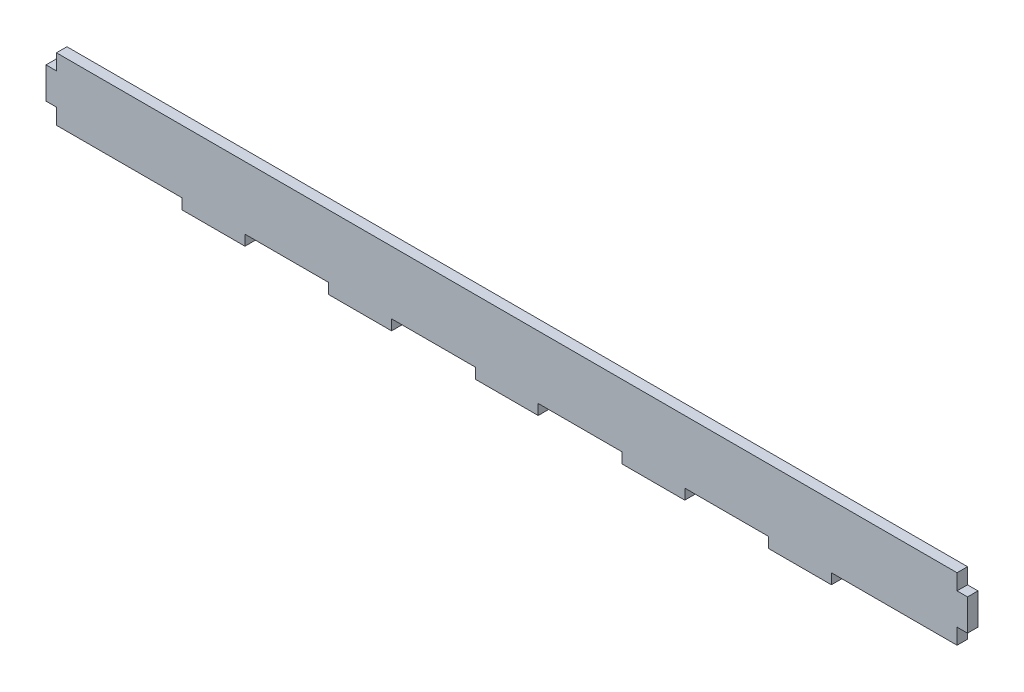
ISO-10303-21;
HEADER;
FILE_DESCRIPTION(('STEP AP214'),'2;1');
FILE_NAME('part.step','',(''),(''),'','','');
FILE_SCHEMA(('AUTOMOTIVE_DESIGN { 1 0 10303 214 1 1 1 1 }'));
ENDSEC;
DATA;
#1=APPLICATION_CONTEXT('core data for automotive mechanical design processes');
#2=APPLICATION_PROTOCOL_DEFINITION('international standard','automotive_design',2000,#1);
#3=PRODUCT_CONTEXT('',#1,'mechanical');
#4=PRODUCT('Part','Part','',(#3));
#5=PRODUCT_RELATED_PRODUCT_CATEGORY('part','',(#4));
#6=PRODUCT_DEFINITION_FORMATION('','',#4);
#7=PRODUCT_DEFINITION_CONTEXT('part definition',#1,'design');
#8=PRODUCT_DEFINITION('design','',#6,#7);
#9=PRODUCT_DEFINITION_SHAPE('','',#8);
#10=(LENGTH_UNIT() NAMED_UNIT(*) SI_UNIT(.MILLI.,.METRE.));
#11=(NAMED_UNIT(*) PLANE_ANGLE_UNIT() SI_UNIT($,.RADIAN.));
#12=(NAMED_UNIT(*) SI_UNIT($,.STERADIAN.) SOLID_ANGLE_UNIT());
#13=UNCERTAINTY_MEASURE_WITH_UNIT(LENGTH_MEASURE(1.E-05),#10,'distance_accuracy_value','');
#14=(GEOMETRIC_REPRESENTATION_CONTEXT(3) GLOBAL_UNCERTAINTY_ASSIGNED_CONTEXT((#13)) GLOBAL_UNIT_ASSIGNED_CONTEXT((#10,
#11,#12)) REPRESENTATION_CONTEXT('',''));
#15=CARTESIAN_POINT('',(0.,0.,0.));
#16=DIRECTION('',(0.,0.,1.));
#17=DIRECTION('',(1.,0.,0.));
#18=AXIS2_PLACEMENT_3D('',#15,#16,#17);
#19=CARTESIAN_POINT('',(0.,-400.000000000006,-5.));
#20=DIRECTION('',(0.,-1.,0.));
#21=DIRECTION('',(0.,0.,-1.));
#22=AXIS2_PLACEMENT_3D('',#19,#20,#21);
#23=PLANE('',#22);
#24=DIRECTION('',(1.,0.,0.));
#25=VECTOR('',#24,1.);
#26=CARTESIAN_POINT('',(0.,-400.000000000006,0.));
#27=LINE('',#26,#25);
#28=CARTESIAN_POINT('',(9.99972860464549,-400.000000000006,0.));
#29=VERTEX_POINT('',#28);
#30=CARTESIAN_POINT('',(440.000271395355,-400.000000000006,0.));
#31=VERTEX_POINT('',#30);
#32=EDGE_CURVE('E280',#29,#31,#27,.T.);
#33=ORIENTED_EDGE('',*,*,#32,.T.);
#34=DIRECTION('',(0.,0.,1.));
#35=VECTOR('',#34,1.);
#36=CARTESIAN_POINT('',(440.000271395355,-400.000000000006,-5.));
#37=LINE('',#36,#35);
#38=CARTESIAN_POINT('',(440.000271395355,-400.000000000006,-5.));
#39=VERTEX_POINT('',#38);
#40=EDGE_CURVE('E11',#39,#31,#37,.T.);
#41=ORIENTED_EDGE('',*,*,#40,.F.);
#42=DIRECTION('',(1.,0.,0.));
#43=VECTOR('',#42,1.);
#44=CARTESIAN_POINT('',(0.,-400.000000000006,-5.));
#45=LINE('',#44,#43);
#46=CARTESIAN_POINT('',(9.99972860464549,-400.000000000006,-5.));
#47=VERTEX_POINT('',#46);
#48=EDGE_CURVE('E57',#47,#39,#45,.T.);
#49=ORIENTED_EDGE('',*,*,#48,.F.);
#50=DIRECTION('',(0.,0.,1.));
#51=VECTOR('',#50,1.);
#52=CARTESIAN_POINT('',(9.99972860464549,-400.000000000006,-5.));
#53=LINE('',#52,#51);
#54=EDGE_CURVE('E42',#47,#29,#53,.T.);
#55=ORIENTED_EDGE('',*,*,#54,.T.);
#56=EDGE_LOOP('',(#33,#41,#49,#55));
#57=FACE_BOUND('',#56,.T.);
#58=ADVANCED_FACE('F39',(#57),#23,.F.);
#59=CARTESIAN_POINT('',(440.000271395355,0.,-5.));
#60=DIRECTION('',(1.,0.,0.));
#61=DIRECTION('',(0.,0.,-1.));
#62=AXIS2_PLACEMENT_3D('',#59,#60,#61);
#63=PLANE('',#62);
#64=DIRECTION('',(0.,1.,0.));
#65=VECTOR('',#64,1.);
#66=CARTESIAN_POINT('',(440.000271395355,0.,0.));
#67=LINE('',#66,#65);
#68=CARTESIAN_POINT('',(440.000271395355,-407.500000000006,0.));
#69=VERTEX_POINT('',#68);
#70=EDGE_CURVE('E355',#69,#31,#67,.T.);
#71=ORIENTED_EDGE('',*,*,#70,.F.);
#72=DIRECTION('',(0.,0.,1.));
#73=VECTOR('',#72,1.);
#74=CARTESIAN_POINT('',(440.000271395355,-407.500000000006,-5.));
#75=LINE('',#74,#73);
#76=CARTESIAN_POINT('',(440.000271395355,-407.500000000006,-5.));
#77=VERTEX_POINT('',#76);
#78=EDGE_CURVE('E48',#77,#69,#75,.T.);
#79=ORIENTED_EDGE('',*,*,#78,.F.);
#80=DIRECTION('',(0.,1.,0.));
#81=VECTOR('',#80,1.);
#82=CARTESIAN_POINT('',(440.000271395355,0.,-5.));
#83=LINE('',#82,#81);
#84=EDGE_CURVE('E262',#77,#39,#83,.T.);
#85=ORIENTED_EDGE('',*,*,#84,.T.);
#86=ORIENTED_EDGE('',*,*,#40,.T.);
#87=EDGE_LOOP('',(#71,#79,#85,#86));
#88=FACE_BOUND('',#87,.T.);
#89=ADVANCED_FACE('F433',(#88),#63,.T.);
#90=CARTESIAN_POINT('',(-4.5244044057695E-12,-407.500000000001,-5.));
#91=DIRECTION('',(0.,-1.,0.));
#92=DIRECTION('',(1.,0.,0.));
#93=AXIS2_PLACEMENT_3D('',#90,#91,#92);
#94=PLANE('',#93);
#95=DIRECTION('',(1.,0.,0.));
#96=VECTOR('',#95,1.);
#97=CARTESIAN_POINT('',(-4.5244044057695E-12,-407.500000000001,0.));
#98=LINE('',#97,#96);
#99=CARTESIAN_POINT('',(445.00000000005,-407.500000000006,0.));
#100=VERTEX_POINT('',#99);
#101=EDGE_CURVE('E266',#69,#100,#98,.T.);
#102=ORIENTED_EDGE('',*,*,#101,.T.);
#103=DIRECTION('',(0.,0.,1.));
#104=VECTOR('',#103,1.);
#105=CARTESIAN_POINT('',(445.00000000005,-407.500000000006,-5.));
#106=LINE('',#105,#104);
#107=CARTESIAN_POINT('',(445.00000000005,-407.500000000006,-5.));
#108=VERTEX_POINT('',#107);
#109=EDGE_CURVE('E264',#108,#100,#106,.T.);
#110=ORIENTED_EDGE('',*,*,#109,.F.);
#111=DIRECTION('',(1.,0.,0.));
#112=VECTOR('',#111,1.);
#113=CARTESIAN_POINT('',(-4.5244044057695E-12,-407.500000000001,-5.));
#114=LINE('',#113,#112);
#115=EDGE_CURVE('E255',#77,#108,#114,.T.);
#116=ORIENTED_EDGE('',*,*,#115,.F.);
#117=ORIENTED_EDGE('',*,*,#78,.T.);
#118=EDGE_LOOP('',(#102,#110,#116,#117));
#119=FACE_BOUND('',#118,.T.);
#120=ADVANCED_FACE('F265',(#119),#94,.F.);
#121=CARTESIAN_POINT('',(445.00000000005,0.,-5.));
#122=DIRECTION('',(1.,0.,0.));
#123=DIRECTION('',(0.,0.,-1.));
#124=AXIS2_PLACEMENT_3D('',#121,#122,#123);
#125=PLANE('',#124);
#126=DIRECTION('',(0.,1.,0.));
#127=VECTOR('',#126,1.);
#128=CARTESIAN_POINT('',(445.00000000005,0.,0.));
#129=LINE('',#128,#127);
#130=CARTESIAN_POINT('',(445.00000000005,-422.500000000006,0.));
#131=VERTEX_POINT('',#130);
#132=EDGE_CURVE('E352',#131,#100,#129,.T.);
#133=ORIENTED_EDGE('',*,*,#132,.F.);
#134=DIRECTION('',(0.,0.,1.));
#135=VECTOR('',#134,1.);
#136=CARTESIAN_POINT('',(445.00000000005,-422.500000000006,-5.));
#137=LINE('',#136,#135);
#138=CARTESIAN_POINT('',(445.00000000005,-422.500000000006,-5.));
#139=VERTEX_POINT('',#138);
#140=EDGE_CURVE('E270',#139,#131,#137,.T.);
#141=ORIENTED_EDGE('',*,*,#140,.F.);
#142=DIRECTION('',(0.,1.,0.));
#143=VECTOR('',#142,1.);
#144=CARTESIAN_POINT('',(445.00000000005,0.,-5.));
#145=LINE('',#144,#143);
#146=EDGE_CURVE('E260',#139,#108,#145,.T.);
#147=ORIENTED_EDGE('',*,*,#146,.T.);
#148=ORIENTED_EDGE('',*,*,#109,.T.);
#149=EDGE_LOOP('',(#133,#141,#147,#148));
#150=FACE_BOUND('',#149,.T.);
#151=ADVANCED_FACE('F272',(#150),#125,.T.);
#152=CARTESIAN_POINT('',(0.,-422.500000000006,-5.));
#153=DIRECTION('',(0.,-1.,0.));
#154=DIRECTION('',(0.,0.,-1.));
#155=AXIS2_PLACEMENT_3D('',#152,#153,#154);
#156=PLANE('',#155);
#157=DIRECTION('',(1.,0.,0.));
#158=VECTOR('',#157,1.);
#159=CARTESIAN_POINT('',(0.,-422.500000000006,0.));
#160=LINE('',#159,#158);
#161=CARTESIAN_POINT('',(440.000271395355,-422.500000000006,0.));
#162=VERTEX_POINT('',#161);
#163=EDGE_CURVE('E349',#162,#131,#160,.T.);
#164=ORIENTED_EDGE('',*,*,#163,.F.);
#165=DIRECTION('',(0.,0.,1.));
#166=VECTOR('',#165,1.);
#167=CARTESIAN_POINT('',(440.000271395355,-422.500000000006,-5.));
#168=LINE('',#167,#166);
#169=CARTESIAN_POINT('',(440.000271395355,-422.500000000006,-5.));
#170=VERTEX_POINT('',#169);
#171=EDGE_CURVE('E360',#170,#162,#168,.T.);
#172=ORIENTED_EDGE('',*,*,#171,.F.);
#173=DIRECTION('',(1.,0.,0.));
#174=VECTOR('',#173,1.);
#175=CARTESIAN_POINT('',(0.,-422.500000000006,-5.));
#176=LINE('',#175,#174);
#177=EDGE_CURVE('E273',#170,#139,#176,.T.);
#178=ORIENTED_EDGE('',*,*,#177,.T.);
#179=ORIENTED_EDGE('',*,*,#140,.T.);
#180=EDGE_LOOP('',(#164,#172,#178,#179));
#181=FACE_BOUND('',#180,.T.);
#182=ADVANCED_FACE('F446',(#181),#156,.T.);
#183=CARTESIAN_POINT('',(440.000271395355,0.,-5.));
#184=DIRECTION('',(1.,0.,0.));
#185=DIRECTION('',(0.,0.,-1.));
#186=AXIS2_PLACEMENT_3D('',#183,#184,#185);
#187=PLANE('',#186);
#188=DIRECTION('',(0.,1.,0.));
#189=VECTOR('',#188,1.);
#190=CARTESIAN_POINT('',(440.000271395355,0.,0.));
#191=LINE('',#190,#189);
#192=CARTESIAN_POINT('',(440.000271395355,-430.000000000006,0.));
#193=VERTEX_POINT('',#192);
#194=EDGE_CURVE('E346',#193,#162,#191,.T.);
#195=ORIENTED_EDGE('',*,*,#194,.F.);
#196=DIRECTION('',(0.,0.,1.));
#197=VECTOR('',#196,1.);
#198=CARTESIAN_POINT('',(440.000271395355,-430.000000000006,-5.));
#199=LINE('',#198,#197);
#200=CARTESIAN_POINT('',(440.000271395355,-430.000000000006,-5.));
#201=VERTEX_POINT('',#200);
#202=EDGE_CURVE('E362',#201,#193,#199,.T.);
#203=ORIENTED_EDGE('',*,*,#202,.F.);
#204=DIRECTION('',(0.,1.,0.));
#205=VECTOR('',#204,1.);
#206=CARTESIAN_POINT('',(440.000271395355,0.,-5.));
#207=LINE('',#206,#205);
#208=EDGE_CURVE('E275',#201,#170,#207,.T.);
#209=ORIENTED_EDGE('',*,*,#208,.T.);
#210=ORIENTED_EDGE('',*,*,#171,.T.);
#211=EDGE_LOOP('',(#195,#203,#209,#210));
#212=FACE_BOUND('',#211,.T.);
#213=ADVANCED_FACE('F449',(#212),#187,.T.);
#214=CARTESIAN_POINT('',(0.,-430.000000000006,-5.));
#215=DIRECTION('',(0.,1.,0.));
#216=DIRECTION('',(0.,0.,1.));
#217=AXIS2_PLACEMENT_3D('',#214,#215,#216);
#218=PLANE('',#217);
#219=DIRECTION('',(-1.,0.,0.));
#220=VECTOR('',#219,1.);
#221=CARTESIAN_POINT('',(0.,-430.000000000006,0.));
#222=LINE('',#221,#220);
#223=CARTESIAN_POINT('',(380.,-430.000000000006,0.));
#224=VERTEX_POINT('',#223);
#225=EDGE_CURVE('E344',#193,#224,#222,.T.);
#226=ORIENTED_EDGE('',*,*,#225,.T.);
#227=DIRECTION('',(0.,0.,1.));
#228=VECTOR('',#227,1.);
#229=CARTESIAN_POINT('',(380.,-430.000000000006,-5.));
#230=LINE('',#229,#228);
#231=CARTESIAN_POINT('',(380.,-430.000000000006,-5.));
#232=VERTEX_POINT('',#231);
#233=EDGE_CURVE('E364',#232,#224,#230,.T.);
#234=ORIENTED_EDGE('',*,*,#233,.F.);
#235=DIRECTION('',(-1.,0.,0.));
#236=VECTOR('',#235,1.);
#237=CARTESIAN_POINT('',(0.,-430.000000000006,-5.));
#238=LINE('',#237,#236);
#239=EDGE_CURVE('E956',#201,#232,#238,.T.);
#240=ORIENTED_EDGE('',*,*,#239,.F.);
#241=ORIENTED_EDGE('',*,*,#202,.T.);
#242=EDGE_LOOP('',(#226,#234,#240,#241));
#243=FACE_BOUND('',#242,.T.);
#244=ADVANCED_FACE('F453',(#243),#218,.F.);
#245=CARTESIAN_POINT('',(380.,0.,-5.));
#246=DIRECTION('',(-1.,0.,0.));
#247=DIRECTION('',(0.,0.,1.));
#248=AXIS2_PLACEMENT_3D('',#245,#246,#247);
#249=PLANE('',#248);
#250=DIRECTION('',(0.,-1.,0.));
#251=VECTOR('',#250,1.);
#252=CARTESIAN_POINT('',(380.,0.,0.));
#253=LINE('',#252,#251);
#254=CARTESIAN_POINT('',(380.,-435.,0.));
#255=VERTEX_POINT('',#254);
#256=EDGE_CURVE('E342',#224,#255,#253,.T.);
#257=ORIENTED_EDGE('',*,*,#256,.T.);
#258=DIRECTION('',(0.,0.,1.));
#259=VECTOR('',#258,1.);
#260=CARTESIAN_POINT('',(380.,-435.,-5.));
#261=LINE('',#260,#259);
#262=CARTESIAN_POINT('',(380.,-435.,-5.));
#263=VERTEX_POINT('',#262);
#264=EDGE_CURVE('E367',#263,#255,#261,.T.);
#265=ORIENTED_EDGE('',*,*,#264,.F.);
#266=DIRECTION('',(0.,-1.,0.));
#267=VECTOR('',#266,1.);
#268=CARTESIAN_POINT('',(380.,0.,-5.));
#269=LINE('',#268,#267);
#270=EDGE_CURVE('E954',#232,#263,#269,.T.);
#271=ORIENTED_EDGE('',*,*,#270,.F.);
#272=ORIENTED_EDGE('',*,*,#233,.T.);
#273=EDGE_LOOP('',(#257,#265,#271,#272));
#274=FACE_BOUND('',#273,.T.);
#275=ADVANCED_FACE('F457',(#274),#249,.F.);
#276=CARTESIAN_POINT('',(1.60982338570648E-12,-435.000000000001,-5.));
#277=DIRECTION('',(0.,1.,0.));
#278=DIRECTION('',(-1.,0.,0.));
#279=AXIS2_PLACEMENT_3D('',#276,#277,#278);
#280=PLANE('',#279);
#281=DIRECTION('',(-1.,0.,0.));
#282=VECTOR('',#281,1.);
#283=CARTESIAN_POINT('',(1.60982338570648E-12,-435.000000000001,0.));
#284=LINE('',#283,#282);
#285=CARTESIAN_POINT('',(350.,-435.,0.));
#286=VERTEX_POINT('',#285);
#287=EDGE_CURVE('E339',#255,#286,#284,.T.);
#288=ORIENTED_EDGE('',*,*,#287,.T.);
#289=DIRECTION('',(0.,0.,1.));
#290=VECTOR('',#289,1.);
#291=CARTESIAN_POINT('',(350.,-435.,-5.));
#292=LINE('',#291,#290);
#293=CARTESIAN_POINT('',(350.,-435.,-5.));
#294=VERTEX_POINT('',#293);
#295=EDGE_CURVE('E370',#294,#286,#292,.T.);
#296=ORIENTED_EDGE('',*,*,#295,.F.);
#297=DIRECTION('',(-1.,0.,0.));
#298=VECTOR('',#297,1.);
#299=CARTESIAN_POINT('',(1.60982338570648E-12,-435.000000000001,-5.));
#300=LINE('',#299,#298);
#301=EDGE_CURVE('E963',#263,#294,#300,.T.);
#302=ORIENTED_EDGE('',*,*,#301,.F.);
#303=ORIENTED_EDGE('',*,*,#264,.T.);
#304=EDGE_LOOP('',(#288,#296,#302,#303));
#305=FACE_BOUND('',#304,.T.);
#306=ADVANCED_FACE('F461',(#305),#280,.F.);
#307=CARTESIAN_POINT('',(350.,0.,-5.));
#308=DIRECTION('',(-1.,0.,0.));
#309=DIRECTION('',(0.,0.,1.));
#310=AXIS2_PLACEMENT_3D('',#307,#308,#309);
#311=PLANE('',#310);
#312=DIRECTION('',(0.,-1.,0.));
#313=VECTOR('',#312,1.);
#314=CARTESIAN_POINT('',(350.,0.,0.));
#315=LINE('',#314,#313);
#316=CARTESIAN_POINT('',(350.,-430.000000000006,0.));
#317=VERTEX_POINT('',#316);
#318=EDGE_CURVE('E336',#317,#286,#315,.T.);
#319=ORIENTED_EDGE('',*,*,#318,.F.);
#320=DIRECTION('',(0.,0.,1.));
#321=VECTOR('',#320,1.);
#322=CARTESIAN_POINT('',(350.,-430.000000000006,-5.));
#323=LINE('',#322,#321);
#324=CARTESIAN_POINT('',(350.,-430.000000000006,-5.));
#325=VERTEX_POINT('',#324);
#326=EDGE_CURVE('E372',#325,#317,#323,.T.);
#327=ORIENTED_EDGE('',*,*,#326,.F.);
#328=DIRECTION('',(0.,-1.,0.));
#329=VECTOR('',#328,1.);
#330=CARTESIAN_POINT('',(350.,0.,-5.));
#331=LINE('',#330,#329);
#332=EDGE_CURVE('E946',#325,#294,#331,.T.);
#333=ORIENTED_EDGE('',*,*,#332,.T.);
#334=ORIENTED_EDGE('',*,*,#295,.T.);
#335=EDGE_LOOP('',(#319,#327,#333,#334));
#336=FACE_BOUND('',#335,.T.);
#337=ADVANCED_FACE('F465',(#336),#311,.T.);
#338=CARTESIAN_POINT('',(-5.96744875736029E-13,-430.000000000005,-5.));
#339=DIRECTION('',(0.,1.,0.));
#340=DIRECTION('',(-1.,0.,0.));
#341=AXIS2_PLACEMENT_3D('',#338,#339,#340);
#342=PLANE('',#341);
#343=DIRECTION('',(-1.,0.,0.));
#344=VECTOR('',#343,1.);
#345=CARTESIAN_POINT('',(-5.96744875736029E-13,-430.000000000005,0.));
#346=LINE('',#345,#344);
#347=CARTESIAN_POINT('',(310.,-430.000000000006,0.));
#348=VERTEX_POINT('',#347);
#349=EDGE_CURVE('E334',#317,#348,#346,.T.);
#350=ORIENTED_EDGE('',*,*,#349,.T.);
#351=DIRECTION('',(0.,0.,1.));
#352=VECTOR('',#351,1.);
#353=CARTESIAN_POINT('',(310.,-430.000000000006,-5.));
#354=LINE('',#353,#352);
#355=CARTESIAN_POINT('',(310.,-430.000000000006,-5.));
#356=VERTEX_POINT('',#355);
#357=EDGE_CURVE('E374',#356,#348,#354,.T.);
#358=ORIENTED_EDGE('',*,*,#357,.F.);
#359=DIRECTION('',(-1.,0.,0.));
#360=VECTOR('',#359,1.);
#361=CARTESIAN_POINT('',(-5.96744875736029E-13,-430.000000000005,-5.));
#362=LINE('',#361,#360);
#363=EDGE_CURVE('E940',#325,#356,#362,.T.);
#364=ORIENTED_EDGE('',*,*,#363,.F.);
#365=ORIENTED_EDGE('',*,*,#326,.T.);
#366=EDGE_LOOP('',(#350,#358,#364,#365));
#367=FACE_BOUND('',#366,.T.);
#368=ADVANCED_FACE('F469',(#367),#342,.F.);
#369=CARTESIAN_POINT('',(310.,0.,-5.));
#370=DIRECTION('',(-1.,0.,0.));
#371=DIRECTION('',(0.,0.,1.));
#372=AXIS2_PLACEMENT_3D('',#369,#370,#371);
#373=PLANE('',#372);
#374=DIRECTION('',(0.,-1.,0.));
#375=VECTOR('',#374,1.);
#376=CARTESIAN_POINT('',(310.,0.,0.));
#377=LINE('',#376,#375);
#378=CARTESIAN_POINT('',(310.,-435.,0.));
#379=VERTEX_POINT('',#378);
#380=EDGE_CURVE('E332',#348,#379,#377,.T.);
#381=ORIENTED_EDGE('',*,*,#380,.T.);
#382=DIRECTION('',(0.,0.,1.));
#383=VECTOR('',#382,1.);
#384=CARTESIAN_POINT('',(310.,-435.,-5.));
#385=LINE('',#384,#383);
#386=CARTESIAN_POINT('',(310.,-435.,-5.));
#387=VERTEX_POINT('',#386);
#388=EDGE_CURVE('E377',#387,#379,#385,.T.);
#389=ORIENTED_EDGE('',*,*,#388,.F.);
#390=DIRECTION('',(0.,-1.,0.));
#391=VECTOR('',#390,1.);
#392=CARTESIAN_POINT('',(310.,0.,-5.));
#393=LINE('',#392,#391);
#394=EDGE_CURVE('E937',#356,#387,#393,.T.);
#395=ORIENTED_EDGE('',*,*,#394,.F.);
#396=ORIENTED_EDGE('',*,*,#357,.T.);
#397=EDGE_LOOP('',(#381,#389,#395,#396));
#398=FACE_BOUND('',#397,.T.);
#399=ADVANCED_FACE('F473',(#398),#373,.F.);
#400=CARTESIAN_POINT('',(1.60982338570648E-12,-435.000000000001,-5.));
#401=DIRECTION('',(0.,1.,0.));
#402=DIRECTION('',(-1.,0.,0.));
#403=AXIS2_PLACEMENT_3D('',#400,#401,#402);
#404=PLANE('',#403);
#405=DIRECTION('',(-1.,0.,0.));
#406=VECTOR('',#405,1.);
#407=CARTESIAN_POINT('',(1.60982338570648E-12,-435.000000000001,0.));
#408=LINE('',#407,#406);
#409=CARTESIAN_POINT('',(280.,-435.,0.));
#410=VERTEX_POINT('',#409);
#411=EDGE_CURVE('E329',#379,#410,#408,.T.);
#412=ORIENTED_EDGE('',*,*,#411,.T.);
#413=DIRECTION('',(0.,0.,1.));
#414=VECTOR('',#413,1.);
#415=CARTESIAN_POINT('',(280.,-435.,-5.));
#416=LINE('',#415,#414);
#417=CARTESIAN_POINT('',(280.,-435.,-5.));
#418=VERTEX_POINT('',#417);
#419=EDGE_CURVE('E380',#418,#410,#416,.T.);
#420=ORIENTED_EDGE('',*,*,#419,.F.);
#421=DIRECTION('',(-1.,0.,0.));
#422=VECTOR('',#421,1.);
#423=CARTESIAN_POINT('',(1.60982338570648E-12,-435.000000000001,-5.));
#424=LINE('',#423,#422);
#425=EDGE_CURVE('E935',#387,#418,#424,.T.);
#426=ORIENTED_EDGE('',*,*,#425,.F.);
#427=ORIENTED_EDGE('',*,*,#388,.T.);
#428=EDGE_LOOP('',(#412,#420,#426,#427));
#429=FACE_BOUND('',#428,.T.);
#430=ADVANCED_FACE('F477',(#429),#404,.F.);
#431=CARTESIAN_POINT('',(280.,0.,-5.));
#432=DIRECTION('',(-1.,0.,0.));
#433=DIRECTION('',(0.,0.,1.));
#434=AXIS2_PLACEMENT_3D('',#431,#432,#433);
#435=PLANE('',#434);
#436=DIRECTION('',(0.,-1.,0.));
#437=VECTOR('',#436,1.);
#438=CARTESIAN_POINT('',(280.,0.,0.));
#439=LINE('',#438,#437);
#440=CARTESIAN_POINT('',(280.,-430.000000000006,0.));
#441=VERTEX_POINT('',#440);
#442=EDGE_CURVE('E326',#441,#410,#439,.T.);
#443=ORIENTED_EDGE('',*,*,#442,.F.);
#444=DIRECTION('',(0.,0.,1.));
#445=VECTOR('',#444,1.);
#446=CARTESIAN_POINT('',(280.,-430.000000000006,-5.));
#447=LINE('',#446,#445);
#448=CARTESIAN_POINT('',(280.,-430.000000000006,-5.));
#449=VERTEX_POINT('',#448);
#450=EDGE_CURVE('E382',#449,#441,#447,.T.);
#451=ORIENTED_EDGE('',*,*,#450,.F.);
#452=DIRECTION('',(0.,-1.,0.));
#453=VECTOR('',#452,1.);
#454=CARTESIAN_POINT('',(280.,0.,-5.));
#455=LINE('',#454,#453);
#456=EDGE_CURVE('E928',#449,#418,#455,.T.);
#457=ORIENTED_EDGE('',*,*,#456,.T.);
#458=ORIENTED_EDGE('',*,*,#419,.T.);
#459=EDGE_LOOP('',(#443,#451,#457,#458));
#460=FACE_BOUND('',#459,.T.);
#461=ADVANCED_FACE('F481',(#460),#435,.T.);
#462=CARTESIAN_POINT('',(-5.96744875736029E-13,-430.000000000005,-5.));
#463=DIRECTION('',(0.,1.,0.));
#464=DIRECTION('',(-1.,0.,0.));
#465=AXIS2_PLACEMENT_3D('',#462,#463,#464);
#466=PLANE('',#465);
#467=DIRECTION('',(-1.,0.,0.));
#468=VECTOR('',#467,1.);
#469=CARTESIAN_POINT('',(-5.96744875736029E-13,-430.000000000005,0.));
#470=LINE('',#469,#468);
#471=CARTESIAN_POINT('',(240.,-430.000000000006,0.));
#472=VERTEX_POINT('',#471);
#473=EDGE_CURVE('E324',#441,#472,#470,.T.);
#474=ORIENTED_EDGE('',*,*,#473,.T.);
#475=DIRECTION('',(0.,0.,1.));
#476=VECTOR('',#475,1.);
#477=CARTESIAN_POINT('',(240.,-430.000000000006,-5.));
#478=LINE('',#477,#476);
#479=CARTESIAN_POINT('',(240.,-430.000000000006,-5.));
#480=VERTEX_POINT('',#479);
#481=EDGE_CURVE('E384',#480,#472,#478,.T.);
#482=ORIENTED_EDGE('',*,*,#481,.F.);
#483=DIRECTION('',(-1.,0.,0.));
#484=VECTOR('',#483,1.);
#485=CARTESIAN_POINT('',(-5.96744875736029E-13,-430.000000000005,-5.));
#486=LINE('',#485,#484);
#487=EDGE_CURVE('E925',#449,#480,#486,.T.);
#488=ORIENTED_EDGE('',*,*,#487,.F.);
#489=ORIENTED_EDGE('',*,*,#450,.T.);
#490=EDGE_LOOP('',(#474,#482,#488,#489));
#491=FACE_BOUND('',#490,.T.);
#492=ADVANCED_FACE('F485',(#491),#466,.F.);
#493=CARTESIAN_POINT('',(240.,0.,-5.));
#494=DIRECTION('',(-1.,0.,0.));
#495=DIRECTION('',(0.,0.,1.));
#496=AXIS2_PLACEMENT_3D('',#493,#494,#495);
#497=PLANE('',#496);
#498=DIRECTION('',(0.,-1.,0.));
#499=VECTOR('',#498,1.);
#500=CARTESIAN_POINT('',(240.,0.,0.));
#501=LINE('',#500,#499);
#502=CARTESIAN_POINT('',(240.,-435.,0.));
#503=VERTEX_POINT('',#502);
#504=EDGE_CURVE('E322',#472,#503,#501,.T.);
#505=ORIENTED_EDGE('',*,*,#504,.T.);
#506=DIRECTION('',(0.,0.,1.));
#507=VECTOR('',#506,1.);
#508=CARTESIAN_POINT('',(240.,-435.,-5.));
#509=LINE('',#508,#507);
#510=CARTESIAN_POINT('',(240.,-435.,-5.));
#511=VERTEX_POINT('',#510);
#512=EDGE_CURVE('E387',#511,#503,#509,.T.);
#513=ORIENTED_EDGE('',*,*,#512,.F.);
#514=DIRECTION('',(0.,-1.,0.));
#515=VECTOR('',#514,1.);
#516=CARTESIAN_POINT('',(240.,0.,-5.));
#517=LINE('',#516,#515);
#518=EDGE_CURVE('E923',#480,#511,#517,.T.);
#519=ORIENTED_EDGE('',*,*,#518,.F.);
#520=ORIENTED_EDGE('',*,*,#481,.T.);
#521=EDGE_LOOP('',(#505,#513,#519,#520));
#522=FACE_BOUND('',#521,.T.);
#523=ADVANCED_FACE('F489',(#522),#497,.F.);
#524=CARTESIAN_POINT('',(1.60982338570648E-12,-435.000000000001,-5.));
#525=DIRECTION('',(0.,1.,0.));
#526=DIRECTION('',(-1.,0.,0.));
#527=AXIS2_PLACEMENT_3D('',#524,#525,#526);
#528=PLANE('',#527);
#529=DIRECTION('',(-1.,0.,0.));
#530=VECTOR('',#529,1.);
#531=CARTESIAN_POINT('',(1.60982338570648E-12,-435.000000000001,0.));
#532=LINE('',#531,#530);
#533=CARTESIAN_POINT('',(210.,-435.,0.));
#534=VERTEX_POINT('',#533);
#535=EDGE_CURVE('E319',#503,#534,#532,.T.);
#536=ORIENTED_EDGE('',*,*,#535,.T.);
#537=DIRECTION('',(0.,0.,1.));
#538=VECTOR('',#537,1.);
#539=CARTESIAN_POINT('',(210.,-435.,-5.));
#540=LINE('',#539,#538);
#541=CARTESIAN_POINT('',(210.,-435.,-5.));
#542=VERTEX_POINT('',#541);
#543=EDGE_CURVE('E390',#542,#534,#540,.T.);
#544=ORIENTED_EDGE('',*,*,#543,.F.);
#545=DIRECTION('',(-1.,0.,0.));
#546=VECTOR('',#545,1.);
#547=CARTESIAN_POINT('',(1.60982338570648E-12,-435.000000000001,-5.));
#548=LINE('',#547,#546);
#549=EDGE_CURVE('E972',#511,#542,#548,.T.);
#550=ORIENTED_EDGE('',*,*,#549,.F.);
#551=ORIENTED_EDGE('',*,*,#512,.T.);
#552=EDGE_LOOP('',(#536,#544,#550,#551));
#553=FACE_BOUND('',#552,.T.);
#554=ADVANCED_FACE('F493',(#553),#528,.F.);
#555=CARTESIAN_POINT('',(210.,0.,-5.));
#556=DIRECTION('',(-1.,0.,0.));
#557=DIRECTION('',(0.,0.,1.));
#558=AXIS2_PLACEMENT_3D('',#555,#556,#557);
#559=PLANE('',#558);
#560=DIRECTION('',(0.,-1.,0.));
#561=VECTOR('',#560,1.);
#562=CARTESIAN_POINT('',(210.,0.,0.));
#563=LINE('',#562,#561);
#564=CARTESIAN_POINT('',(210.,-430.000000000006,0.));
#565=VERTEX_POINT('',#564);
#566=EDGE_CURVE('E316',#565,#534,#563,.T.);
#567=ORIENTED_EDGE('',*,*,#566,.F.);
#568=DIRECTION('',(0.,0.,1.));
#569=VECTOR('',#568,1.);
#570=CARTESIAN_POINT('',(210.,-430.000000000006,-5.));
#571=LINE('',#570,#569);
#572=CARTESIAN_POINT('',(210.,-430.000000000006,-5.));
#573=VERTEX_POINT('',#572);
#574=EDGE_CURVE('E392',#573,#565,#571,.T.);
#575=ORIENTED_EDGE('',*,*,#574,.F.);
#576=DIRECTION('',(0.,-1.,0.));
#577=VECTOR('',#576,1.);
#578=CARTESIAN_POINT('',(210.,0.,-5.));
#579=LINE('',#578,#577);
#580=EDGE_CURVE('E915',#573,#542,#579,.T.);
#581=ORIENTED_EDGE('',*,*,#580,.T.);
#582=ORIENTED_EDGE('',*,*,#543,.T.);
#583=EDGE_LOOP('',(#567,#575,#581,#582));
#584=FACE_BOUND('',#583,.T.);
#585=ADVANCED_FACE('F497',(#584),#559,.T.);
#586=CARTESIAN_POINT('',(-5.96744875736029E-13,-430.000000000006,-5.));
#587=DIRECTION('',(0.,1.,0.));
#588=DIRECTION('',(-1.,0.,0.));
#589=AXIS2_PLACEMENT_3D('',#586,#587,#588);
#590=PLANE('',#589);
#591=DIRECTION('',(-1.,0.,0.));
#592=VECTOR('',#591,1.);
#593=CARTESIAN_POINT('',(-5.96744875736029E-13,-430.000000000006,0.));
#594=LINE('',#593,#592);
#595=CARTESIAN_POINT('',(170.,-430.000000000006,0.));
#596=VERTEX_POINT('',#595);
#597=EDGE_CURVE('E314',#565,#596,#594,.T.);
#598=ORIENTED_EDGE('',*,*,#597,.T.);
#599=DIRECTION('',(0.,0.,1.));
#600=VECTOR('',#599,1.);
#601=CARTESIAN_POINT('',(170.,-430.000000000006,-5.));
#602=LINE('',#601,#600);
#603=CARTESIAN_POINT('',(170.,-430.000000000006,-5.));
#604=VERTEX_POINT('',#603);
#605=EDGE_CURVE('E394',#604,#596,#602,.T.);
#606=ORIENTED_EDGE('',*,*,#605,.F.);
#607=DIRECTION('',(-1.,0.,0.));
#608=VECTOR('',#607,1.);
#609=CARTESIAN_POINT('',(-5.96744875736029E-13,-430.000000000006,-5.));
#610=LINE('',#609,#608);
#611=EDGE_CURVE('E909',#573,#604,#610,.T.);
#612=ORIENTED_EDGE('',*,*,#611,.F.);
#613=ORIENTED_EDGE('',*,*,#574,.T.);
#614=EDGE_LOOP('',(#598,#606,#612,#613));
#615=FACE_BOUND('',#614,.T.);
#616=ADVANCED_FACE('F501',(#615),#590,.F.);
#617=CARTESIAN_POINT('',(170.,0.,-5.));
#618=DIRECTION('',(-1.,0.,0.));
#619=DIRECTION('',(0.,0.,1.));
#620=AXIS2_PLACEMENT_3D('',#617,#618,#619);
#621=PLANE('',#620);
#622=DIRECTION('',(0.,-1.,0.));
#623=VECTOR('',#622,1.);
#624=CARTESIAN_POINT('',(170.,0.,0.));
#625=LINE('',#624,#623);
#626=CARTESIAN_POINT('',(170.,-435.,0.));
#627=VERTEX_POINT('',#626);
#628=EDGE_CURVE('E312',#596,#627,#625,.T.);
#629=ORIENTED_EDGE('',*,*,#628,.T.);
#630=DIRECTION('',(0.,0.,1.));
#631=VECTOR('',#630,1.);
#632=CARTESIAN_POINT('',(170.,-435.,-5.));
#633=LINE('',#632,#631);
#634=CARTESIAN_POINT('',(170.,-435.,-5.));
#635=VERTEX_POINT('',#634);
#636=EDGE_CURVE('E397',#635,#627,#633,.T.);
#637=ORIENTED_EDGE('',*,*,#636,.F.);
#638=DIRECTION('',(0.,-1.,0.));
#639=VECTOR('',#638,1.);
#640=CARTESIAN_POINT('',(170.,0.,-5.));
#641=LINE('',#640,#639);
#642=EDGE_CURVE('E906',#604,#635,#641,.T.);
#643=ORIENTED_EDGE('',*,*,#642,.F.);
#644=ORIENTED_EDGE('',*,*,#605,.T.);
#645=EDGE_LOOP('',(#629,#637,#643,#644));
#646=FACE_BOUND('',#645,.T.);
#647=ADVANCED_FACE('F505',(#646),#621,.F.);
#648=CARTESIAN_POINT('',(1.60982338570648E-12,-435.000000000001,-5.));
#649=DIRECTION('',(0.,1.,0.));
#650=DIRECTION('',(-1.,0.,0.));
#651=AXIS2_PLACEMENT_3D('',#648,#649,#650);
#652=PLANE('',#651);
#653=DIRECTION('',(-1.,0.,0.));
#654=VECTOR('',#653,1.);
#655=CARTESIAN_POINT('',(1.60982338570648E-12,-435.000000000001,0.));
#656=LINE('',#655,#654);
#657=CARTESIAN_POINT('',(140.,-435.,0.));
#658=VERTEX_POINT('',#657);
#659=EDGE_CURVE('E309',#627,#658,#656,.T.);
#660=ORIENTED_EDGE('',*,*,#659,.T.);
#661=DIRECTION('',(0.,0.,1.));
#662=VECTOR('',#661,1.);
#663=CARTESIAN_POINT('',(140.,-435.,-5.));
#664=LINE('',#663,#662);
#665=CARTESIAN_POINT('',(140.,-435.,-5.));
#666=VERTEX_POINT('',#665);
#667=EDGE_CURVE('E400',#666,#658,#664,.T.);
#668=ORIENTED_EDGE('',*,*,#667,.F.);
#669=DIRECTION('',(-1.,0.,0.));
#670=VECTOR('',#669,1.);
#671=CARTESIAN_POINT('',(1.60982338570648E-12,-435.000000000001,-5.));
#672=LINE('',#671,#670);
#673=EDGE_CURVE('E904',#635,#666,#672,.T.);
#674=ORIENTED_EDGE('',*,*,#673,.F.);
#675=ORIENTED_EDGE('',*,*,#636,.T.);
#676=EDGE_LOOP('',(#660,#668,#674,#675));
#677=FACE_BOUND('',#676,.T.);
#678=ADVANCED_FACE('F509',(#677),#652,.F.);
#679=CARTESIAN_POINT('',(140.,0.,-5.));
#680=DIRECTION('',(-1.,0.,0.));
#681=DIRECTION('',(0.,0.,1.));
#682=AXIS2_PLACEMENT_3D('',#679,#680,#681);
#683=PLANE('',#682);
#684=DIRECTION('',(0.,-1.,0.));
#685=VECTOR('',#684,1.);
#686=CARTESIAN_POINT('',(140.,0.,0.));
#687=LINE('',#686,#685);
#688=CARTESIAN_POINT('',(140.,-430.000000000006,0.));
#689=VERTEX_POINT('',#688);
#690=EDGE_CURVE('E306',#689,#658,#687,.T.);
#691=ORIENTED_EDGE('',*,*,#690,.F.);
#692=DIRECTION('',(0.,0.,1.));
#693=VECTOR('',#692,1.);
#694=CARTESIAN_POINT('',(140.,-430.000000000006,-5.));
#695=LINE('',#694,#693);
#696=CARTESIAN_POINT('',(140.,-430.000000000006,-5.));
#697=VERTEX_POINT('',#696);
#698=EDGE_CURVE('E402',#697,#689,#695,.T.);
#699=ORIENTED_EDGE('',*,*,#698,.F.);
#700=DIRECTION('',(0.,-1.,0.));
#701=VECTOR('',#700,1.);
#702=CARTESIAN_POINT('',(140.,0.,-5.));
#703=LINE('',#702,#701);
#704=EDGE_CURVE('E897',#697,#666,#703,.T.);
#705=ORIENTED_EDGE('',*,*,#704,.T.);
#706=ORIENTED_EDGE('',*,*,#667,.T.);
#707=EDGE_LOOP('',(#691,#699,#705,#706));
#708=FACE_BOUND('',#707,.T.);
#709=ADVANCED_FACE('F513',(#708),#683,.T.);
#710=CARTESIAN_POINT('',(-5.96744875736029E-13,-430.000000000006,-5.));
#711=DIRECTION('',(0.,1.,0.));
#712=DIRECTION('',(-1.,0.,0.));
#713=AXIS2_PLACEMENT_3D('',#710,#711,#712);
#714=PLANE('',#713);
#715=DIRECTION('',(-1.,0.,0.));
#716=VECTOR('',#715,1.);
#717=CARTESIAN_POINT('',(-5.96744875736029E-13,-430.000000000006,0.));
#718=LINE('',#717,#716);
#719=CARTESIAN_POINT('',(100.,-430.000000000006,0.));
#720=VERTEX_POINT('',#719);
#721=EDGE_CURVE('E304',#689,#720,#718,.T.);
#722=ORIENTED_EDGE('',*,*,#721,.T.);
#723=DIRECTION('',(0.,0.,1.));
#724=VECTOR('',#723,1.);
#725=CARTESIAN_POINT('',(100.,-430.000000000006,-5.));
#726=LINE('',#725,#724);
#727=CARTESIAN_POINT('',(100.,-430.000000000006,-5.));
#728=VERTEX_POINT('',#727);
#729=EDGE_CURVE('E404',#728,#720,#726,.T.);
#730=ORIENTED_EDGE('',*,*,#729,.F.);
#731=DIRECTION('',(-1.,0.,0.));
#732=VECTOR('',#731,1.);
#733=CARTESIAN_POINT('',(-5.96744875736029E-13,-430.000000000006,-5.));
#734=LINE('',#733,#732);
#735=EDGE_CURVE('E894',#697,#728,#734,.T.);
#736=ORIENTED_EDGE('',*,*,#735,.F.);
#737=ORIENTED_EDGE('',*,*,#698,.T.);
#738=EDGE_LOOP('',(#722,#730,#736,#737));
#739=FACE_BOUND('',#738,.T.);
#740=ADVANCED_FACE('F517',(#739),#714,.F.);
#741=CARTESIAN_POINT('',(100.,0.,-5.));
#742=DIRECTION('',(-1.,0.,0.));
#743=DIRECTION('',(0.,0.,1.));
#744=AXIS2_PLACEMENT_3D('',#741,#742,#743);
#745=PLANE('',#744);
#746=DIRECTION('',(0.,-1.,0.));
#747=VECTOR('',#746,1.);
#748=CARTESIAN_POINT('',(100.,0.,0.));
#749=LINE('',#748,#747);
#750=CARTESIAN_POINT('',(100.,-435.,0.));
#751=VERTEX_POINT('',#750);
#752=EDGE_CURVE('E302',#720,#751,#749,.T.);
#753=ORIENTED_EDGE('',*,*,#752,.T.);
#754=DIRECTION('',(0.,0.,1.));
#755=VECTOR('',#754,1.);
#756=CARTESIAN_POINT('',(100.,-435.,-5.));
#757=LINE('',#756,#755);
#758=CARTESIAN_POINT('',(100.,-435.,-5.));
#759=VERTEX_POINT('',#758);
#760=EDGE_CURVE('E407',#759,#751,#757,.T.);
#761=ORIENTED_EDGE('',*,*,#760,.F.);
#762=DIRECTION('',(0.,-1.,0.));
#763=VECTOR('',#762,1.);
#764=CARTESIAN_POINT('',(100.,0.,-5.));
#765=LINE('',#764,#763);
#766=EDGE_CURVE('E892',#728,#759,#765,.T.);
#767=ORIENTED_EDGE('',*,*,#766,.F.);
#768=ORIENTED_EDGE('',*,*,#729,.T.);
#769=EDGE_LOOP('',(#753,#761,#767,#768));
#770=FACE_BOUND('',#769,.T.);
#771=ADVANCED_FACE('F521',(#770),#745,.F.);
#772=CARTESIAN_POINT('',(1.60982338570648E-12,-435.,-5.));
#773=DIRECTION('',(0.,1.,0.));
#774=DIRECTION('',(-1.,0.,0.));
#775=AXIS2_PLACEMENT_3D('',#772,#773,#774);
#776=PLANE('',#775);
#777=DIRECTION('',(-1.,0.,0.));
#778=VECTOR('',#777,1.);
#779=CARTESIAN_POINT('',(1.60982338570648E-12,-435.,0.));
#780=LINE('',#779,#778);
#781=CARTESIAN_POINT('',(70.,-435.,0.));
#782=VERTEX_POINT('',#781);
#783=EDGE_CURVE('E299',#751,#782,#780,.T.);
#784=ORIENTED_EDGE('',*,*,#783,.T.);
#785=DIRECTION('',(0.,0.,1.));
#786=VECTOR('',#785,1.);
#787=CARTESIAN_POINT('',(70.,-435.,-5.));
#788=LINE('',#787,#786);
#789=CARTESIAN_POINT('',(70.,-435.,-5.));
#790=VERTEX_POINT('',#789);
#791=EDGE_CURVE('E410',#790,#782,#788,.T.);
#792=ORIENTED_EDGE('',*,*,#791,.F.);
#793=DIRECTION('',(-1.,0.,0.));
#794=VECTOR('',#793,1.);
#795=CARTESIAN_POINT('',(1.60982338570648E-12,-435.,-5.));
#796=LINE('',#795,#794);
#797=EDGE_CURVE('E981',#759,#790,#796,.T.);
#798=ORIENTED_EDGE('',*,*,#797,.F.);
#799=ORIENTED_EDGE('',*,*,#760,.T.);
#800=EDGE_LOOP('',(#784,#792,#798,#799));
#801=FACE_BOUND('',#800,.T.);
#802=ADVANCED_FACE('F525',(#801),#776,.F.);
#803=CARTESIAN_POINT('',(70.,0.,-5.));
#804=DIRECTION('',(-1.,0.,0.));
#805=DIRECTION('',(0.,0.,1.));
#806=AXIS2_PLACEMENT_3D('',#803,#804,#805);
#807=PLANE('',#806);
#808=DIRECTION('',(0.,-1.,0.));
#809=VECTOR('',#808,1.);
#810=CARTESIAN_POINT('',(70.,0.,0.));
#811=LINE('',#810,#809);
#812=CARTESIAN_POINT('',(70.,-430.000000000006,0.));
#813=VERTEX_POINT('',#812);
#814=EDGE_CURVE('E296',#813,#782,#811,.T.);
#815=ORIENTED_EDGE('',*,*,#814,.F.);
#816=DIRECTION('',(0.,0.,1.));
#817=VECTOR('',#816,1.);
#818=CARTESIAN_POINT('',(70.,-430.000000000006,-5.));
#819=LINE('',#818,#817);
#820=CARTESIAN_POINT('',(70.,-430.000000000006,-5.));
#821=VERTEX_POINT('',#820);
#822=EDGE_CURVE('E412',#821,#813,#819,.T.);
#823=ORIENTED_EDGE('',*,*,#822,.F.);
#824=DIRECTION('',(0.,-1.,0.));
#825=VECTOR('',#824,1.);
#826=CARTESIAN_POINT('',(70.,0.,-5.));
#827=LINE('',#826,#825);
#828=EDGE_CURVE('E884',#821,#790,#827,.T.);
#829=ORIENTED_EDGE('',*,*,#828,.T.);
#830=ORIENTED_EDGE('',*,*,#791,.T.);
#831=EDGE_LOOP('',(#815,#823,#829,#830));
#832=FACE_BOUND('',#831,.T.);
#833=ADVANCED_FACE('F529',(#832),#807,.T.);
#834=CARTESIAN_POINT('',(0.,-430.000000000006,-5.));
#835=DIRECTION('',(0.,1.,0.));
#836=DIRECTION('',(0.,0.,1.));
#837=AXIS2_PLACEMENT_3D('',#834,#835,#836);
#838=PLANE('',#837);
#839=DIRECTION('',(-1.,0.,0.));
#840=VECTOR('',#839,1.);
#841=CARTESIAN_POINT('',(0.,-430.000000000006,0.));
#842=LINE('',#841,#840);
#843=CARTESIAN_POINT('',(9.99972860464549,-430.000000000006,0.));
#844=VERTEX_POINT('',#843);
#845=EDGE_CURVE('E294',#813,#844,#842,.T.);
#846=ORIENTED_EDGE('',*,*,#845,.T.);
#847=DIRECTION('',(0.,0.,1.));
#848=VECTOR('',#847,1.);
#849=CARTESIAN_POINT('',(9.99972860464549,-430.000000000006,-5.));
#850=LINE('',#849,#848);
#851=CARTESIAN_POINT('',(9.99972860464549,-430.000000000006,-5.));
#852=VERTEX_POINT('',#851);
#853=EDGE_CURVE('E414',#852,#844,#850,.T.);
#854=ORIENTED_EDGE('',*,*,#853,.F.);
#855=DIRECTION('',(-1.,0.,0.));
#856=VECTOR('',#855,1.);
#857=CARTESIAN_POINT('',(0.,-430.000000000006,-5.));
#858=LINE('',#857,#856);
#859=EDGE_CURVE('E984',#821,#852,#858,.T.);
#860=ORIENTED_EDGE('',*,*,#859,.F.);
#861=ORIENTED_EDGE('',*,*,#822,.T.);
#862=EDGE_LOOP('',(#846,#854,#860,#861));
#863=FACE_BOUND('',#862,.T.);
#864=ADVANCED_FACE('F533',(#863),#838,.F.);
#865=CARTESIAN_POINT('',(9.99972860464549,0.,-5.));
#866=DIRECTION('',(1.,0.,0.));
#867=DIRECTION('',(0.,0.,-1.));
#868=AXIS2_PLACEMENT_3D('',#865,#866,#867);
#869=PLANE('',#868);
#870=DIRECTION('',(0.,1.,0.));
#871=VECTOR('',#870,1.);
#872=CARTESIAN_POINT('',(9.99972860464549,0.,0.));
#873=LINE('',#872,#871);
#874=CARTESIAN_POINT('',(9.99972860464549,-422.500000000006,0.));
#875=VERTEX_POINT('',#874);
#876=EDGE_CURVE('E292',#844,#875,#873,.T.);
#877=ORIENTED_EDGE('',*,*,#876,.T.);
#878=DIRECTION('',(0.,0.,1.));
#879=VECTOR('',#878,1.);
#880=CARTESIAN_POINT('',(9.99972860464549,-422.500000000006,-5.));
#881=LINE('',#880,#879);
#882=CARTESIAN_POINT('',(9.99972860464549,-422.500000000006,-5.));
#883=VERTEX_POINT('',#882);
#884=EDGE_CURVE('E417',#883,#875,#881,.T.);
#885=ORIENTED_EDGE('',*,*,#884,.F.);
#886=DIRECTION('',(0.,1.,0.));
#887=VECTOR('',#886,1.);
#888=CARTESIAN_POINT('',(9.99972860464549,0.,-5.));
#889=LINE('',#888,#887);
#890=EDGE_CURVE('E875',#852,#883,#889,.T.);
#891=ORIENTED_EDGE('',*,*,#890,.F.);
#892=ORIENTED_EDGE('',*,*,#853,.T.);
#893=EDGE_LOOP('',(#877,#885,#891,#892));
#894=FACE_BOUND('',#893,.T.);
#895=ADVANCED_FACE('F537',(#894),#869,.F.);
#896=CARTESIAN_POINT('',(0.,-422.500000000006,-5.));
#897=DIRECTION('',(0.,1.,0.));
#898=DIRECTION('',(0.,0.,1.));
#899=AXIS2_PLACEMENT_3D('',#896,#897,#898);
#900=PLANE('',#899);
#901=DIRECTION('',(-1.,0.,0.));
#902=VECTOR('',#901,1.);
#903=CARTESIAN_POINT('',(0.,-422.500000000006,0.));
#904=LINE('',#903,#902);
#905=CARTESIAN_POINT('',(4.99999999994966,-422.500000000006,0.));
#906=VERTEX_POINT('',#905);
#907=EDGE_CURVE('E290',#875,#906,#904,.T.);
#908=ORIENTED_EDGE('',*,*,#907,.T.);
#909=DIRECTION('',(0.,0.,1.));
#910=VECTOR('',#909,1.);
#911=CARTESIAN_POINT('',(4.99999999994966,-422.500000000006,-5.));
#912=LINE('',#911,#910);
#913=CARTESIAN_POINT('',(4.99999999994966,-422.500000000006,-5.));
#914=VERTEX_POINT('',#913);
#915=EDGE_CURVE('E420',#914,#906,#912,.T.);
#916=ORIENTED_EDGE('',*,*,#915,.F.);
#917=DIRECTION('',(-1.,0.,0.));
#918=VECTOR('',#917,1.);
#919=CARTESIAN_POINT('',(0.,-422.500000000006,-5.));
#920=LINE('',#919,#918);
#921=EDGE_CURVE('E872',#883,#914,#920,.T.);
#922=ORIENTED_EDGE('',*,*,#921,.F.);
#923=ORIENTED_EDGE('',*,*,#884,.T.);
#924=EDGE_LOOP('',(#908,#916,#922,#923));
#925=FACE_BOUND('',#924,.T.);
#926=ADVANCED_FACE('F541',(#925),#900,.F.);
#927=CARTESIAN_POINT('',(4.99999999994966,0.,-5.));
#928=DIRECTION('',(1.,0.,0.));
#929=DIRECTION('',(0.,0.,-1.));
#930=AXIS2_PLACEMENT_3D('',#927,#928,#929);
#931=PLANE('',#930);
#932=DIRECTION('',(0.,1.,0.));
#933=VECTOR('',#932,1.);
#934=CARTESIAN_POINT('',(4.99999999994966,0.,0.));
#935=LINE('',#934,#933);
#936=CARTESIAN_POINT('',(4.99999999994966,-407.500000000006,0.));
#937=VERTEX_POINT('',#936);
#938=EDGE_CURVE('E287',#906,#937,#935,.T.);
#939=ORIENTED_EDGE('',*,*,#938,.T.);
#940=DIRECTION('',(0.,0.,1.));
#941=VECTOR('',#940,1.);
#942=CARTESIAN_POINT('',(4.99999999994966,-407.500000000006,-5.));
#943=LINE('',#942,#941);
#944=CARTESIAN_POINT('',(4.99999999994966,-407.500000000006,-5.));
#945=VERTEX_POINT('',#944);
#946=EDGE_CURVE('E423',#945,#937,#943,.T.);
#947=ORIENTED_EDGE('',*,*,#946,.F.);
#948=DIRECTION('',(0.,1.,0.));
#949=VECTOR('',#948,1.);
#950=CARTESIAN_POINT('',(4.99999999994966,0.,-5.));
#951=LINE('',#950,#949);
#952=EDGE_CURVE('E870',#914,#945,#951,.T.);
#953=ORIENTED_EDGE('',*,*,#952,.F.);
#954=ORIENTED_EDGE('',*,*,#915,.T.);
#955=EDGE_LOOP('',(#939,#947,#953,#954));
#956=FACE_BOUND('',#955,.T.);
#957=ADVANCED_FACE('F545',(#956),#931,.F.);
#958=CARTESIAN_POINT('',(4.52440440576956E-12,-407.500000000006,-5.));
#959=DIRECTION('',(0.,1.,0.));
#960=DIRECTION('',(-1.,0.,0.));
#961=AXIS2_PLACEMENT_3D('',#958,#959,#960);
#962=PLANE('',#961);
#963=DIRECTION('',(-1.,0.,0.));
#964=VECTOR('',#963,1.);
#965=CARTESIAN_POINT('',(4.52440440576956E-12,-407.500000000006,0.));
#966=LINE('',#965,#964);
#967=CARTESIAN_POINT('',(9.99972860464549,-407.500000000006,0.));
#968=VERTEX_POINT('',#967);
#969=EDGE_CURVE('E284',#968,#937,#966,.T.);
#970=ORIENTED_EDGE('',*,*,#969,.F.);
#971=DIRECTION('',(0.,0.,1.));
#972=VECTOR('',#971,1.);
#973=CARTESIAN_POINT('',(9.99972860464549,-407.500000000006,-5.));
#974=LINE('',#973,#972);
#975=CARTESIAN_POINT('',(9.99972860464549,-407.500000000006,-5.));
#976=VERTEX_POINT('',#975);
#977=EDGE_CURVE('E424',#976,#968,#974,.T.);
#978=ORIENTED_EDGE('',*,*,#977,.F.);
#979=DIRECTION('',(-1.,0.,0.));
#980=VECTOR('',#979,1.);
#981=CARTESIAN_POINT('',(4.52440440576956E-12,-407.500000000006,-5.));
#982=LINE('',#981,#980);
#983=EDGE_CURVE('E989',#976,#945,#982,.T.);
#984=ORIENTED_EDGE('',*,*,#983,.T.);
#985=ORIENTED_EDGE('',*,*,#946,.T.);
#986=EDGE_LOOP('',(#970,#978,#984,#985));
#987=FACE_BOUND('',#986,.T.);
#988=ADVANCED_FACE('F549',(#987),#962,.T.);
#989=CARTESIAN_POINT('',(9.99972860464549,0.,-5.));
#990=DIRECTION('',(1.,0.,0.));
#991=DIRECTION('',(0.,0.,-1.));
#992=AXIS2_PLACEMENT_3D('',#989,#990,#991);
#993=PLANE('',#992);
#994=DIRECTION('',(0.,1.,0.));
#995=VECTOR('',#994,1.);
#996=CARTESIAN_POINT('',(9.99972860464549,0.,0.));
#997=LINE('',#996,#995);
#998=EDGE_CURVE('E282',#968,#29,#997,.T.);
#999=ORIENTED_EDGE('',*,*,#998,.T.);
#1000=ORIENTED_EDGE('',*,*,#54,.F.);
#1001=DIRECTION('',(0.,1.,0.));
#1002=VECTOR('',#1001,1.);
#1003=CARTESIAN_POINT('',(9.99972860464549,0.,-5.));
#1004=LINE('',#1003,#1002);
#1005=EDGE_CURVE('E168',#976,#47,#1004,.T.);
#1006=ORIENTED_EDGE('',*,*,#1005,.F.);
#1007=ORIENTED_EDGE('',*,*,#977,.T.);
#1008=EDGE_LOOP('',(#999,#1000,#1006,#1007));
#1009=FACE_BOUND('',#1008,.T.);
#1010=ADVANCED_FACE('F552',(#1009),#993,.F.);
#1011=CARTESIAN_POINT('',(0.,0.,-5.));
#1012=DIRECTION('',(0.,0.,1.));
#1013=DIRECTION('',(1.,0.,0.));
#1014=AXIS2_PLACEMENT_3D('',#1011,#1012,#1013);
#1015=PLANE('',#1014);
#1016=ORIENTED_EDGE('',*,*,#48,.T.);
#1017=ORIENTED_EDGE('',*,*,#84,.F.);
#1018=ORIENTED_EDGE('',*,*,#115,.T.);
#1019=ORIENTED_EDGE('',*,*,#146,.F.);
#1020=ORIENTED_EDGE('',*,*,#177,.F.);
#1021=ORIENTED_EDGE('',*,*,#208,.F.);
#1022=ORIENTED_EDGE('',*,*,#239,.T.);
#1023=ORIENTED_EDGE('',*,*,#270,.T.);
#1024=ORIENTED_EDGE('',*,*,#301,.T.);
#1025=ORIENTED_EDGE('',*,*,#332,.F.);
#1026=ORIENTED_EDGE('',*,*,#363,.T.);
#1027=ORIENTED_EDGE('',*,*,#394,.T.);
#1028=ORIENTED_EDGE('',*,*,#425,.T.);
#1029=ORIENTED_EDGE('',*,*,#456,.F.);
#1030=ORIENTED_EDGE('',*,*,#487,.T.);
#1031=ORIENTED_EDGE('',*,*,#518,.T.);
#1032=ORIENTED_EDGE('',*,*,#549,.T.);
#1033=ORIENTED_EDGE('',*,*,#580,.F.);
#1034=ORIENTED_EDGE('',*,*,#611,.T.);
#1035=ORIENTED_EDGE('',*,*,#642,.T.);
#1036=ORIENTED_EDGE('',*,*,#673,.T.);
#1037=ORIENTED_EDGE('',*,*,#704,.F.);
#1038=ORIENTED_EDGE('',*,*,#735,.T.);
#1039=ORIENTED_EDGE('',*,*,#766,.T.);
#1040=ORIENTED_EDGE('',*,*,#797,.T.);
#1041=ORIENTED_EDGE('',*,*,#828,.F.);
#1042=ORIENTED_EDGE('',*,*,#859,.T.);
#1043=ORIENTED_EDGE('',*,*,#890,.T.);
#1044=ORIENTED_EDGE('',*,*,#921,.T.);
#1045=ORIENTED_EDGE('',*,*,#952,.T.);
#1046=ORIENTED_EDGE('',*,*,#983,.F.);
#1047=ORIENTED_EDGE('',*,*,#1005,.T.);
#1048=EDGE_LOOP('',(#1016,#1017,#1018,#1019,#1020,#1021,#1022,#1023,#1024,#1025,#1026,#1027,
#1028,#1029,#1030,#1031,#1032,#1033,#1034,#1035,#1036,#1037,#1038,#1039,#1040,#1041,#1042,#1043,
#1044,#1045,#1046,#1047));
#1049=FACE_BOUND('',#1048,.T.);
#1050=ADVANCED_FACE('F257',(#1049),#1015,.F.);
#1051=CARTESIAN_POINT('',(0.,0.,0.));
#1052=DIRECTION('',(0.,0.,1.));
#1053=DIRECTION('',(1.,0.,0.));
#1054=AXIS2_PLACEMENT_3D('',#1051,#1052,#1053);
#1055=PLANE('',#1054);
#1056=ORIENTED_EDGE('',*,*,#32,.F.);
#1057=ORIENTED_EDGE('',*,*,#998,.F.);
#1058=ORIENTED_EDGE('',*,*,#969,.T.);
#1059=ORIENTED_EDGE('',*,*,#938,.F.);
#1060=ORIENTED_EDGE('',*,*,#907,.F.);
#1061=ORIENTED_EDGE('',*,*,#876,.F.);
#1062=ORIENTED_EDGE('',*,*,#845,.F.);
#1063=ORIENTED_EDGE('',*,*,#814,.T.);
#1064=ORIENTED_EDGE('',*,*,#783,.F.);
#1065=ORIENTED_EDGE('',*,*,#752,.F.);
#1066=ORIENTED_EDGE('',*,*,#721,.F.);
#1067=ORIENTED_EDGE('',*,*,#690,.T.);
#1068=ORIENTED_EDGE('',*,*,#659,.F.);
#1069=ORIENTED_EDGE('',*,*,#628,.F.);
#1070=ORIENTED_EDGE('',*,*,#597,.F.);
#1071=ORIENTED_EDGE('',*,*,#566,.T.);
#1072=ORIENTED_EDGE('',*,*,#535,.F.);
#1073=ORIENTED_EDGE('',*,*,#504,.F.);
#1074=ORIENTED_EDGE('',*,*,#473,.F.);
#1075=ORIENTED_EDGE('',*,*,#442,.T.);
#1076=ORIENTED_EDGE('',*,*,#411,.F.);
#1077=ORIENTED_EDGE('',*,*,#380,.F.);
#1078=ORIENTED_EDGE('',*,*,#349,.F.);
#1079=ORIENTED_EDGE('',*,*,#318,.T.);
#1080=ORIENTED_EDGE('',*,*,#287,.F.);
#1081=ORIENTED_EDGE('',*,*,#256,.F.);
#1082=ORIENTED_EDGE('',*,*,#225,.F.);
#1083=ORIENTED_EDGE('',*,*,#194,.T.);
#1084=ORIENTED_EDGE('',*,*,#163,.T.);
#1085=ORIENTED_EDGE('',*,*,#132,.T.);
#1086=ORIENTED_EDGE('',*,*,#101,.F.);
#1087=ORIENTED_EDGE('',*,*,#70,.T.);
#1088=EDGE_LOOP('',(#1056,#1057,#1058,#1059,#1060,#1061,#1062,#1063,#1064,#1065,#1066,#1067,
#1068,#1069,#1070,#1071,#1072,#1073,#1074,#1075,#1076,#1077,#1078,#1079,#1080,#1081,#1082,#1083,
#1084,#1085,#1086,#1087));
#1089=FACE_BOUND('',#1088,.T.);
#1090=ADVANCED_FACE('F431',(#1089),#1055,.T.);
#1091=CLOSED_SHELL('',(#58,#89,#120,#151,#182,#213,#244,#275,#306,#337,#368,#399,#430,#461,#492,
#523,#554,#585,#616,#647,#678,#709,#740,#771,#802,#833,#864,#895,#926,#957,#988,#1010,#1050,#1090));
#1092=MANIFOLD_SOLID_BREP('B2',#1091);
#1093=ADVANCED_BREP_SHAPE_REPRESENTATION('',(#18,#1092),#14);
#1094=SHAPE_DEFINITION_REPRESENTATION(#9,#1093);
ENDSEC;
END-ISO-10303-21;
